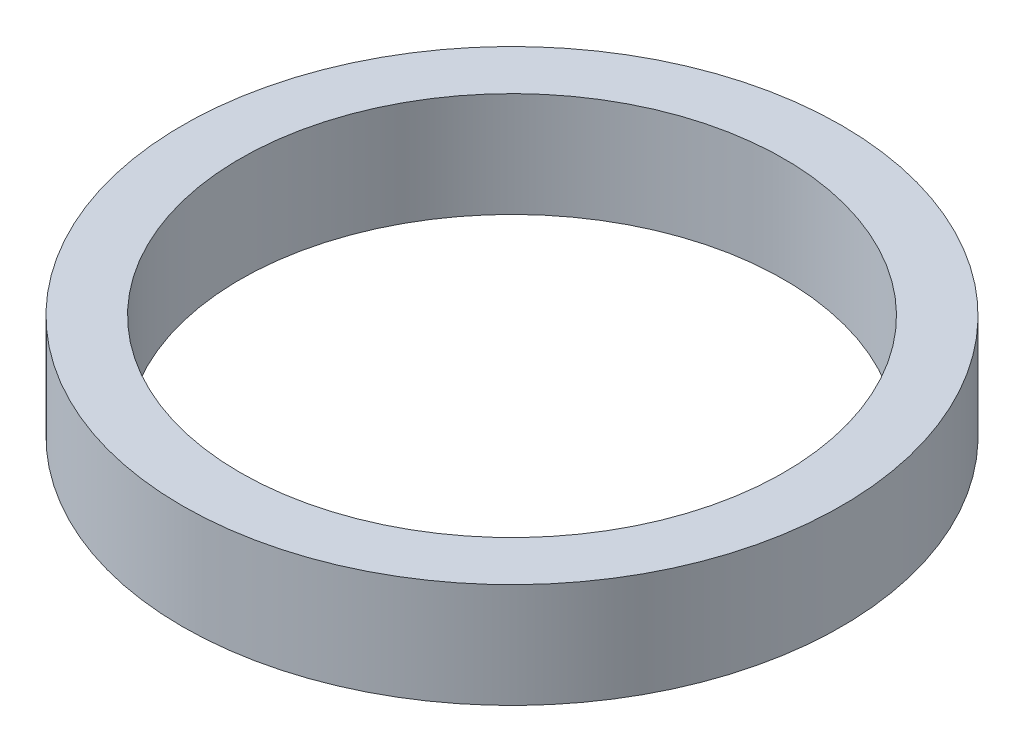
ISO-10303-21;
HEADER;
FILE_DESCRIPTION(('STEP AP214'),'2;1');
FILE_NAME('part.step','',(''),(''),'','','');
FILE_SCHEMA(('AUTOMOTIVE_DESIGN { 1 0 10303 214 1 1 1 1 }'));
ENDSEC;
DATA;
#1=APPLICATION_CONTEXT('core data for automotive mechanical design processes');
#2=APPLICATION_PROTOCOL_DEFINITION('international standard','automotive_design',2000,#1);
#3=PRODUCT_CONTEXT('',#1,'mechanical');
#4=PRODUCT('Part','Part','',(#3));
#5=PRODUCT_RELATED_PRODUCT_CATEGORY('part','',(#4));
#6=PRODUCT_DEFINITION_FORMATION('','',#4);
#7=PRODUCT_DEFINITION_CONTEXT('part definition',#1,'design');
#8=PRODUCT_DEFINITION('design','',#6,#7);
#9=PRODUCT_DEFINITION_SHAPE('','',#8);
#10=(LENGTH_UNIT() NAMED_UNIT(*) SI_UNIT(.MILLI.,.METRE.));
#11=(NAMED_UNIT(*) PLANE_ANGLE_UNIT() SI_UNIT($,.RADIAN.));
#12=(NAMED_UNIT(*) SI_UNIT($,.STERADIAN.) SOLID_ANGLE_UNIT());
#13=UNCERTAINTY_MEASURE_WITH_UNIT(LENGTH_MEASURE(1.E-05),#10,'distance_accuracy_value','');
#14=(GEOMETRIC_REPRESENTATION_CONTEXT(3) GLOBAL_UNCERTAINTY_ASSIGNED_CONTEXT((#13)) GLOBAL_UNIT_ASSIGNED_CONTEXT((#10,
#11,#12)) REPRESENTATION_CONTEXT('',''));
#15=CARTESIAN_POINT('',(0.,0.,0.));
#16=DIRECTION('',(0.,0.,1.));
#17=DIRECTION('',(1.,0.,0.));
#18=AXIS2_PLACEMENT_3D('',#15,#16,#17);
#19=CARTESIAN_POINT('',(0.,7.95,0.));
#20=DIRECTION('',(0.,1.,0.));
#21=DIRECTION('',(0.,0.,1.));
#22=AXIS2_PLACEMENT_3D('',#19,#20,#21);
#23=PLANE('',#22);
#24=CARTESIAN_POINT('',(0.,7.95,0.));
#25=DIRECTION('',(0.,1.,0.));
#26=DIRECTION('',(0.,0.,1.));
#27=AXIS2_PLACEMENT_3D('',#24,#25,#26);
#28=CIRCLE('',#27,20.);
#29=CARTESIAN_POINT('',(0.,7.95,20.));
#30=VERTEX_POINT('',#29);
#31=EDGE_CURVE('E10',#30,#30,#28,.T.);
#32=ORIENTED_EDGE('',*,*,#31,.T.);
#33=EDGE_LOOP('',(#32));
#34=FACE_BOUND('',#33,.T.);
#35=CARTESIAN_POINT('',(0.,7.95,0.));
#36=DIRECTION('',(0.,1.,0.));
#37=DIRECTION('',(0.,0.,1.));
#38=AXIS2_PLACEMENT_3D('',#35,#36,#37);
#39=CIRCLE('',#38,16.5);
#40=CARTESIAN_POINT('',(0.,7.95,16.5));
#41=VERTEX_POINT('',#40);
#42=EDGE_CURVE('E50',#41,#41,#39,.T.);
#43=ORIENTED_EDGE('',*,*,#42,.F.);
#44=EDGE_LOOP('',(#43));
#45=FACE_BOUND('',#44,.T.);
#46=ADVANCED_FACE('F39',(#34,#45),#23,.T.);
#47=CARTESIAN_POINT('',(0.,1.6,0.));
#48=DIRECTION('',(0.,1.,0.));
#49=DIRECTION('',(0.,0.,1.));
#50=AXIS2_PLACEMENT_3D('',#47,#48,#49);
#51=PLANE('',#50);
#52=CARTESIAN_POINT('',(0.,1.6,0.));
#53=DIRECTION('',(0.,1.,0.));
#54=DIRECTION('',(0.,0.,1.));
#55=AXIS2_PLACEMENT_3D('',#52,#53,#54);
#56=CIRCLE('',#55,20.);
#57=CARTESIAN_POINT('',(0.,1.6,20.));
#58=VERTEX_POINT('',#57);
#59=EDGE_CURVE('E43',#58,#58,#56,.T.);
#60=ORIENTED_EDGE('',*,*,#59,.F.);
#61=EDGE_LOOP('',(#60));
#62=FACE_BOUND('',#61,.T.);
#63=CARTESIAN_POINT('',(0.,1.6,0.));
#64=DIRECTION('',(0.,1.,0.));
#65=DIRECTION('',(0.,0.,1.));
#66=AXIS2_PLACEMENT_3D('',#63,#64,#65);
#67=CIRCLE('',#66,16.5);
#68=CARTESIAN_POINT('',(0.,1.6,16.5));
#69=VERTEX_POINT('',#68);
#70=EDGE_CURVE('E52',#69,#69,#67,.T.);
#71=ORIENTED_EDGE('',*,*,#70,.T.);
#72=EDGE_LOOP('',(#71));
#73=FACE_BOUND('',#72,.T.);
#74=ADVANCED_FACE('F62',(#62,#73),#51,.F.);
#75=CARTESIAN_POINT('',(0.,7.95,0.));
#76=DIRECTION('',(0.,-1.,0.));
#77=DIRECTION('',(0.,0.,-1.));
#78=AXIS2_PLACEMENT_3D('',#75,#76,#77);
#79=CYLINDRICAL_SURFACE('',#78,20.);
#80=ORIENTED_EDGE('',*,*,#31,.F.);
#81=EDGE_LOOP('',(#80));
#82=FACE_BOUND('',#81,.T.);
#83=ORIENTED_EDGE('',*,*,#59,.T.);
#84=EDGE_LOOP('',(#83));
#85=FACE_BOUND('',#84,.T.);
#86=ADVANCED_FACE('F41',(#82,#85),#79,.T.);
#87=CARTESIAN_POINT('',(0.,7.95,0.));
#88=DIRECTION('',(0.,-1.,0.));
#89=DIRECTION('',(0.,0.,-1.));
#90=AXIS2_PLACEMENT_3D('',#87,#88,#89);
#91=CYLINDRICAL_SURFACE('',#90,16.5);
#92=ORIENTED_EDGE('',*,*,#42,.T.);
#93=EDGE_LOOP('',(#92));
#94=FACE_BOUND('',#93,.T.);
#95=ORIENTED_EDGE('',*,*,#70,.F.);
#96=EDGE_LOOP('',(#95));
#97=FACE_BOUND('',#96,.T.);
#98=ADVANCED_FACE('F58',(#94,#97),#91,.F.);
#99=CLOSED_SHELL('',(#46,#74,#86,#98));
#100=MANIFOLD_SOLID_BREP('B2',#99);
#101=ADVANCED_BREP_SHAPE_REPRESENTATION('',(#18,#100),#14);
#102=SHAPE_DEFINITION_REPRESENTATION(#9,#101);
ENDSEC;
END-ISO-10303-21;
